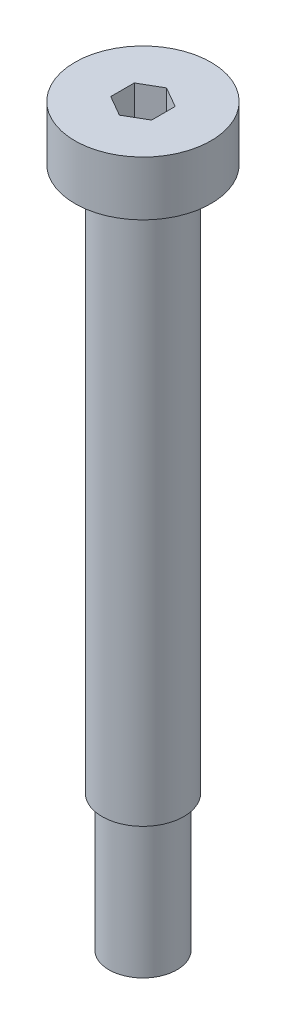
ISO-10303-21;
HEADER;
FILE_DESCRIPTION(('STEP AP214'),'2;1');
FILE_NAME('part.step','',(''),(''),'','','');
FILE_SCHEMA(('AUTOMOTIVE_DESIGN { 1 0 10303 214 1 1 1 1 }'));
ENDSEC;
DATA;
#1=APPLICATION_CONTEXT('core data for automotive mechanical design processes');
#2=APPLICATION_PROTOCOL_DEFINITION('international standard','automotive_design',2000,#1);
#3=PRODUCT_CONTEXT('',#1,'mechanical');
#4=PRODUCT('Part','Part','',(#3));
#5=PRODUCT_RELATED_PRODUCT_CATEGORY('part','',(#4));
#6=PRODUCT_DEFINITION_FORMATION('','',#4);
#7=PRODUCT_DEFINITION_CONTEXT('part definition',#1,'design');
#8=PRODUCT_DEFINITION('design','',#6,#7);
#9=PRODUCT_DEFINITION_SHAPE('','',#8);
#10=(LENGTH_UNIT() NAMED_UNIT(*) SI_UNIT(.MILLI.,.METRE.));
#11=(NAMED_UNIT(*) PLANE_ANGLE_UNIT() SI_UNIT($,.RADIAN.));
#12=(NAMED_UNIT(*) SI_UNIT($,.STERADIAN.) SOLID_ANGLE_UNIT());
#13=UNCERTAINTY_MEASURE_WITH_UNIT(LENGTH_MEASURE(1.E-05),#10,'distance_accuracy_value','');
#14=(GEOMETRIC_REPRESENTATION_CONTEXT(3) GLOBAL_UNCERTAINTY_ASSIGNED_CONTEXT((#13)) GLOBAL_UNIT_ASSIGNED_CONTEXT((#10,
#11,#12)) REPRESENTATION_CONTEXT('',''));
#15=CARTESIAN_POINT('',(0.,0.,0.));
#16=DIRECTION('',(0.,0.,1.));
#17=DIRECTION('',(1.,0.,0.));
#18=AXIS2_PLACEMENT_3D('',#15,#16,#17);
#19=CARTESIAN_POINT('',(0.,0.,0.));
#20=DIRECTION('',(0.,1.,0.));
#21=DIRECTION('',(-1.,0.,0.));
#22=AXIS2_PLACEMENT_3D('',#19,#20,#21);
#23=PLANE('',#22);
#24=DIRECTION('',(0.,0.,-1.));
#25=VECTOR('',#24,1.);
#26=CARTESIAN_POINT('',(1.5,0.,0.866025403784439));
#27=LINE('',#26,#25);
#28=CARTESIAN_POINT('',(1.5,0.,0.866025403784439));
#29=VERTEX_POINT('',#28);
#30=CARTESIAN_POINT('',(1.5,0.,-0.866025403784439));
#31=VERTEX_POINT('',#30);
#32=EDGE_CURVE('E58',#29,#31,#27,.T.);
#33=ORIENTED_EDGE('',*,*,#32,.F.);
#34=DIRECTION('',(0.866025403784439,0.,-0.5));
#35=VECTOR('',#34,1.);
#36=CARTESIAN_POINT('',(0.,0.,1.73205080756888));
#37=LINE('',#36,#35);
#38=CARTESIAN_POINT('',(0.,0.,1.73205080756888));
#39=VERTEX_POINT('',#38);
#40=EDGE_CURVE('E151',#39,#29,#37,.T.);
#41=ORIENTED_EDGE('',*,*,#40,.F.);
#42=DIRECTION('',(0.866025403784439,0.,0.5));
#43=VECTOR('',#42,1.);
#44=CARTESIAN_POINT('',(-1.5,0.,0.866025403784439));
#45=LINE('',#44,#43);
#46=CARTESIAN_POINT('',(-1.5,0.,0.866025403784439));
#47=VERTEX_POINT('',#46);
#48=EDGE_CURVE('E148',#47,#39,#45,.T.);
#49=ORIENTED_EDGE('',*,*,#48,.F.);
#50=DIRECTION('',(0.,0.,1.));
#51=VECTOR('',#50,1.);
#52=CARTESIAN_POINT('',(-1.5,0.,-0.866025403784439));
#53=LINE('',#52,#51);
#54=CARTESIAN_POINT('',(-1.5,0.,-0.866025403784439));
#55=VERTEX_POINT('',#54);
#56=EDGE_CURVE('E106',#55,#47,#53,.T.);
#57=ORIENTED_EDGE('',*,*,#56,.F.);
#58=DIRECTION('',(-0.866025403784439,0.,0.5));
#59=VECTOR('',#58,1.);
#60=CARTESIAN_POINT('',(0.,0.,-1.73205080756888));
#61=LINE('',#60,#59);
#62=CARTESIAN_POINT('',(0.,0.,-1.73205080756888));
#63=VERTEX_POINT('',#62);
#64=EDGE_CURVE('E142',#63,#55,#61,.T.);
#65=ORIENTED_EDGE('',*,*,#64,.F.);
#66=DIRECTION('',(-0.866025403784439,0.,-0.5));
#67=VECTOR('',#66,1.);
#68=CARTESIAN_POINT('',(1.5,0.,-0.866025403784439));
#69=LINE('',#68,#67);
#70=EDGE_CURVE('E138',#31,#63,#69,.T.);
#71=ORIENTED_EDGE('',*,*,#70,.F.);
#72=EDGE_LOOP('',(#33,#41,#49,#57,#65,#71));
#73=FACE_BOUND('',#72,.T.);
#74=CARTESIAN_POINT('',(0.,0.,0.));
#75=DIRECTION('',(0.,1.,0.));
#76=DIRECTION('',(-1.,0.,0.));
#77=AXIS2_PLACEMENT_3D('',#74,#75,#76);
#78=CIRCLE('',#77,5.);
#79=CARTESIAN_POINT('',(-5.,0.,0.));
#80=VERTEX_POINT('',#79);
#81=EDGE_CURVE('E11',#80,#80,#78,.T.);
#82=ORIENTED_EDGE('',*,*,#81,.T.);
#83=EDGE_LOOP('',(#82));
#84=FACE_BOUND('',#83,.T.);
#85=ADVANCED_FACE('F43',(#73,#84),#23,.T.);
#86=CARTESIAN_POINT('',(0.,0.,0.));
#87=DIRECTION('',(0.,1.,0.));
#88=DIRECTION('',(-1.,0.,0.));
#89=AXIS2_PLACEMENT_3D('',#86,#87,#88);
#90=CYLINDRICAL_SURFACE('',#89,5.);
#91=CARTESIAN_POINT('',(0.,-4.,0.));
#92=DIRECTION('',(0.,1.,0.));
#93=DIRECTION('',(-1.,0.,0.));
#94=AXIS2_PLACEMENT_3D('',#91,#92,#93);
#95=CIRCLE('',#94,5.);
#96=CARTESIAN_POINT('',(-5.,-4.,0.));
#97=VERTEX_POINT('',#96);
#98=EDGE_CURVE('E51',#97,#97,#95,.T.);
#99=ORIENTED_EDGE('',*,*,#98,.T.);
#100=EDGE_LOOP('',(#99));
#101=FACE_BOUND('',#100,.T.);
#102=ORIENTED_EDGE('',*,*,#81,.F.);
#103=EDGE_LOOP('',(#102));
#104=FACE_BOUND('',#103,.T.);
#105=ADVANCED_FACE('F185',(#101,#104),#90,.T.);
#106=CARTESIAN_POINT('',(-5.,-4.,0.));
#107=DIRECTION('',(0.,-1.,0.));
#108=DIRECTION('',(1.,0.,0.));
#109=AXIS2_PLACEMENT_3D('',#106,#107,#108);
#110=PLANE('',#109);
#111=CARTESIAN_POINT('',(0.,-4.,0.));
#112=DIRECTION('',(0.,1.,0.));
#113=DIRECTION('',(-1.,0.,0.));
#114=AXIS2_PLACEMENT_3D('',#111,#112,#113);
#115=CIRCLE('',#114,3.);
#116=CARTESIAN_POINT('',(-3.,-4.,0.));
#117=VERTEX_POINT('',#116);
#118=EDGE_CURVE('E178',#117,#117,#115,.T.);
#119=ORIENTED_EDGE('',*,*,#118,.T.);
#120=EDGE_LOOP('',(#119));
#121=FACE_BOUND('',#120,.T.);
#122=ORIENTED_EDGE('',*,*,#98,.F.);
#123=EDGE_LOOP('',(#122));
#124=FACE_BOUND('',#123,.T.);
#125=ADVANCED_FACE('F188',(#121,#124),#110,.T.);
#126=CARTESIAN_POINT('',(0.,0.,0.));
#127=DIRECTION('',(0.,1.,0.));
#128=DIRECTION('',(-1.,0.,0.));
#129=AXIS2_PLACEMENT_3D('',#126,#127,#128);
#130=CYLINDRICAL_SURFACE('',#129,3.);
#131=CARTESIAN_POINT('',(0.,-44.,0.));
#132=DIRECTION('',(0.,1.,0.));
#133=DIRECTION('',(-1.,0.,0.));
#134=AXIS2_PLACEMENT_3D('',#131,#132,#133);
#135=CIRCLE('',#134,3.);
#136=CARTESIAN_POINT('',(-2.99999999999999,-44.,0.));
#137=VERTEX_POINT('',#136);
#138=EDGE_CURVE('E174',#137,#137,#135,.T.);
#139=ORIENTED_EDGE('',*,*,#138,.T.);
#140=EDGE_LOOP('',(#139));
#141=FACE_BOUND('',#140,.T.);
#142=ORIENTED_EDGE('',*,*,#118,.F.);
#143=EDGE_LOOP('',(#142));
#144=FACE_BOUND('',#143,.T.);
#145=ADVANCED_FACE('F190',(#141,#144),#130,.T.);
#146=CARTESIAN_POINT('',(-2.99999999999999,-44.,0.));
#147=DIRECTION('',(0.,-1.,0.));
#148=DIRECTION('',(1.,0.,0.));
#149=AXIS2_PLACEMENT_3D('',#146,#147,#148);
#150=PLANE('',#149);
#151=CARTESIAN_POINT('',(0.,-44.,0.));
#152=DIRECTION('',(0.,1.,0.));
#153=DIRECTION('',(-1.,0.,0.));
#154=AXIS2_PLACEMENT_3D('',#151,#152,#153);
#155=CIRCLE('',#154,2.5);
#156=CARTESIAN_POINT('',(-2.49999999999999,-44.,0.));
#157=VERTEX_POINT('',#156);
#158=EDGE_CURVE('E170',#157,#157,#155,.T.);
#159=ORIENTED_EDGE('',*,*,#158,.T.);
#160=EDGE_LOOP('',(#159));
#161=FACE_BOUND('',#160,.T.);
#162=ORIENTED_EDGE('',*,*,#138,.F.);
#163=EDGE_LOOP('',(#162));
#164=FACE_BOUND('',#163,.T.);
#165=ADVANCED_FACE('F197',(#161,#164),#150,.T.);
#166=CARTESIAN_POINT('',(0.,0.,0.));
#167=DIRECTION('',(0.,1.,0.));
#168=DIRECTION('',(-1.,0.,0.));
#169=AXIS2_PLACEMENT_3D('',#166,#167,#168);
#170=CYLINDRICAL_SURFACE('',#169,2.5);
#171=CARTESIAN_POINT('',(0.,-54.,0.));
#172=DIRECTION('',(0.,1.,0.));
#173=DIRECTION('',(-1.,0.,0.));
#174=AXIS2_PLACEMENT_3D('',#171,#172,#173);
#175=CIRCLE('',#174,2.5);
#176=CARTESIAN_POINT('',(-2.49999999999999,-54.,0.));
#177=VERTEX_POINT('',#176);
#178=EDGE_CURVE('E157',#177,#177,#175,.T.);
#179=ORIENTED_EDGE('',*,*,#178,.T.);
#180=EDGE_LOOP('',(#179));
#181=FACE_BOUND('',#180,.T.);
#182=ORIENTED_EDGE('',*,*,#158,.F.);
#183=EDGE_LOOP('',(#182));
#184=FACE_BOUND('',#183,.T.);
#185=ADVANCED_FACE('F224',(#181,#184),#170,.T.);
#186=CARTESIAN_POINT('',(-2.49999999999999,-54.,0.));
#187=DIRECTION('',(0.,-1.,0.));
#188=DIRECTION('',(1.,0.,0.));
#189=AXIS2_PLACEMENT_3D('',#186,#187,#188);
#190=PLANE('',#189);
#191=ORIENTED_EDGE('',*,*,#178,.F.);
#192=EDGE_LOOP('',(#191));
#193=FACE_BOUND('',#192,.T.);
#194=ADVANCED_FACE('F218',(#193),#190,.T.);
#195=CARTESIAN_POINT('',(1.5,-3.,0.866025403784439));
#196=DIRECTION('',(1.,0.,0.));
#197=DIRECTION('',(0.,0.,-1.));
#198=AXIS2_PLACEMENT_3D('',#195,#196,#197);
#199=PLANE('',#198);
#200=ORIENTED_EDGE('',*,*,#32,.T.);
#201=DIRECTION('',(0.,1.,0.));
#202=VECTOR('',#201,1.);
#203=CARTESIAN_POINT('',(1.5,-3.,-0.866025403784439));
#204=LINE('',#203,#202);
#205=CARTESIAN_POINT('',(1.5,-3.,-0.866025403784439));
#206=VERTEX_POINT('',#205);
#207=EDGE_CURVE('E88',#206,#31,#204,.T.);
#208=ORIENTED_EDGE('',*,*,#207,.F.);
#209=DIRECTION('',(0.,0.,-1.));
#210=VECTOR('',#209,1.);
#211=CARTESIAN_POINT('',(1.5,-3.,0.866025403784439));
#212=LINE('',#211,#210);
#213=CARTESIAN_POINT('',(1.5,-3.,0.866025403784439));
#214=VERTEX_POINT('',#213);
#215=EDGE_CURVE('E154',#214,#206,#212,.T.);
#216=ORIENTED_EDGE('',*,*,#215,.F.);
#217=DIRECTION('',(0.,1.,0.));
#218=VECTOR('',#217,1.);
#219=CARTESIAN_POINT('',(1.5,-3.,0.866025403784439));
#220=LINE('',#219,#218);
#221=EDGE_CURVE('E66',#214,#29,#220,.T.);
#222=ORIENTED_EDGE('',*,*,#221,.T.);
#223=EDGE_LOOP('',(#200,#208,#216,#222));
#224=FACE_BOUND('',#223,.T.);
#225=ADVANCED_FACE('F216',(#224),#199,.F.);
#226=CARTESIAN_POINT('',(0.,-3.,1.73205080756888));
#227=DIRECTION('',(0.5,0.,0.866025403784439));
#228=DIRECTION('',(0.866025403784439,0.,-0.5));
#229=AXIS2_PLACEMENT_3D('',#226,#227,#228);
#230=PLANE('',#229);
#231=ORIENTED_EDGE('',*,*,#40,.T.);
#232=ORIENTED_EDGE('',*,*,#221,.F.);
#233=DIRECTION('',(0.866025403784439,0.,-0.5));
#234=VECTOR('',#233,1.);
#235=CARTESIAN_POINT('',(0.,-3.,1.73205080756888));
#236=LINE('',#235,#234);
#237=CARTESIAN_POINT('',(0.,-3.,1.73205080756888));
#238=VERTEX_POINT('',#237);
#239=EDGE_CURVE('E120',#238,#214,#236,.T.);
#240=ORIENTED_EDGE('',*,*,#239,.F.);
#241=DIRECTION('',(0.,1.,0.));
#242=VECTOR('',#241,1.);
#243=CARTESIAN_POINT('',(0.,-3.,1.73205080756888));
#244=LINE('',#243,#242);
#245=EDGE_CURVE('E111',#238,#39,#244,.T.);
#246=ORIENTED_EDGE('',*,*,#245,.T.);
#247=EDGE_LOOP('',(#231,#232,#240,#246));
#248=FACE_BOUND('',#247,.T.);
#249=ADVANCED_FACE('F217',(#248),#230,.F.);
#250=CARTESIAN_POINT('',(-1.5,-3.,0.866025403784439));
#251=DIRECTION('',(-0.5,0.,0.866025403784439));
#252=DIRECTION('',(0.866025403784439,0.,0.5));
#253=AXIS2_PLACEMENT_3D('',#250,#251,#252);
#254=PLANE('',#253);
#255=ORIENTED_EDGE('',*,*,#48,.T.);
#256=ORIENTED_EDGE('',*,*,#245,.F.);
#257=DIRECTION('',(0.866025403784439,0.,0.5));
#258=VECTOR('',#257,1.);
#259=CARTESIAN_POINT('',(-1.5,-3.,0.866025403784439));
#260=LINE('',#259,#258);
#261=CARTESIAN_POINT('',(-1.5,-3.,0.866025403784439));
#262=VERTEX_POINT('',#261);
#263=EDGE_CURVE('E115',#262,#238,#260,.T.);
#264=ORIENTED_EDGE('',*,*,#263,.F.);
#265=DIRECTION('',(0.,1.,0.));
#266=VECTOR('',#265,1.);
#267=CARTESIAN_POINT('',(-1.5,-3.,0.866025403784439));
#268=LINE('',#267,#266);
#269=EDGE_CURVE('E99',#262,#47,#268,.T.);
#270=ORIENTED_EDGE('',*,*,#269,.T.);
#271=EDGE_LOOP('',(#255,#256,#264,#270));
#272=FACE_BOUND('',#271,.T.);
#273=ADVANCED_FACE('F116',(#272),#254,.F.);
#274=CARTESIAN_POINT('',(-1.5,-3.,-0.866025403784439));
#275=DIRECTION('',(-1.,0.,0.));
#276=DIRECTION('',(0.,-1.,0.));
#277=AXIS2_PLACEMENT_3D('',#274,#275,#276);
#278=PLANE('',#277);
#279=ORIENTED_EDGE('',*,*,#56,.T.);
#280=ORIENTED_EDGE('',*,*,#269,.F.);
#281=DIRECTION('',(0.,0.,1.));
#282=VECTOR('',#281,1.);
#283=CARTESIAN_POINT('',(-1.5,-3.,-0.866025403784439));
#284=LINE('',#283,#282);
#285=CARTESIAN_POINT('',(-1.5,-3.,-0.866025403784439));
#286=VERTEX_POINT('',#285);
#287=EDGE_CURVE('E103',#286,#262,#284,.T.);
#288=ORIENTED_EDGE('',*,*,#287,.F.);
#289=DIRECTION('',(0.,1.,0.));
#290=VECTOR('',#289,1.);
#291=CARTESIAN_POINT('',(-1.5,-3.,-0.866025403784439));
#292=LINE('',#291,#290);
#293=EDGE_CURVE('E112',#286,#55,#292,.T.);
#294=ORIENTED_EDGE('',*,*,#293,.T.);
#295=EDGE_LOOP('',(#279,#280,#288,#294));
#296=FACE_BOUND('',#295,.T.);
#297=ADVANCED_FACE('F101',(#296),#278,.F.);
#298=CARTESIAN_POINT('',(0.,-3.,-1.73205080756888));
#299=DIRECTION('',(-0.5,0.,-0.866025403784439));
#300=DIRECTION('',(-0.866025403784439,0.,0.5));
#301=AXIS2_PLACEMENT_3D('',#298,#299,#300);
#302=PLANE('',#301);
#303=ORIENTED_EDGE('',*,*,#64,.T.);
#304=ORIENTED_EDGE('',*,*,#293,.F.);
#305=DIRECTION('',(-0.866025403784439,0.,0.5));
#306=VECTOR('',#305,1.);
#307=CARTESIAN_POINT('',(0.,-3.,-1.73205080756888));
#308=LINE('',#307,#306);
#309=CARTESIAN_POINT('',(0.,-3.,-1.73205080756888));
#310=VERTEX_POINT('',#309);
#311=EDGE_CURVE('E126',#310,#286,#308,.T.);
#312=ORIENTED_EDGE('',*,*,#311,.F.);
#313=DIRECTION('',(0.,1.,0.));
#314=VECTOR('',#313,1.);
#315=CARTESIAN_POINT('',(0.,-3.,-1.73205080756888));
#316=LINE('',#315,#314);
#317=EDGE_CURVE('E162',#310,#63,#316,.T.);
#318=ORIENTED_EDGE('',*,*,#317,.T.);
#319=EDGE_LOOP('',(#303,#304,#312,#318));
#320=FACE_BOUND('',#319,.T.);
#321=ADVANCED_FACE('F283',(#320),#302,.F.);
#322=CARTESIAN_POINT('',(1.5,-3.,-0.866025403784439));
#323=DIRECTION('',(0.5,0.,-0.866025403784439));
#324=DIRECTION('',(-0.866025403784439,0.,-0.5));
#325=AXIS2_PLACEMENT_3D('',#322,#323,#324);
#326=PLANE('',#325);
#327=ORIENTED_EDGE('',*,*,#70,.T.);
#328=ORIENTED_EDGE('',*,*,#317,.F.);
#329=DIRECTION('',(-0.866025403784439,0.,-0.5));
#330=VECTOR('',#329,1.);
#331=CARTESIAN_POINT('',(1.5,-3.,-0.866025403784439));
#332=LINE('',#331,#330);
#333=EDGE_CURVE('E130',#206,#310,#332,.T.);
#334=ORIENTED_EDGE('',*,*,#333,.F.);
#335=ORIENTED_EDGE('',*,*,#207,.T.);
#336=EDGE_LOOP('',(#327,#328,#334,#335));
#337=FACE_BOUND('',#336,.T.);
#338=ADVANCED_FACE('F212',(#337),#326,.F.);
#339=CARTESIAN_POINT('',(0.,-3.,0.));
#340=DIRECTION('',(0.,1.,0.));
#341=DIRECTION('',(-1.,0.,0.));
#342=AXIS2_PLACEMENT_3D('',#339,#340,#341);
#343=PLANE('',#342);
#344=ORIENTED_EDGE('',*,*,#215,.T.);
#345=ORIENTED_EDGE('',*,*,#333,.T.);
#346=ORIENTED_EDGE('',*,*,#311,.T.);
#347=ORIENTED_EDGE('',*,*,#287,.T.);
#348=ORIENTED_EDGE('',*,*,#263,.T.);
#349=ORIENTED_EDGE('',*,*,#239,.T.);
#350=EDGE_LOOP('',(#344,#345,#346,#347,#348,#349));
#351=FACE_BOUND('',#350,.T.);
#352=ADVANCED_FACE('F123',(#351),#343,.T.);
#353=CLOSED_SHELL('',(#85,#105,#125,#145,#165,#185,#194,#225,#249,#273,#297,#321,#338,#352));
#354=MANIFOLD_SOLID_BREP('B2',#353);
#355=ADVANCED_BREP_SHAPE_REPRESENTATION('',(#18,#354),#14);
#356=SHAPE_DEFINITION_REPRESENTATION(#9,#355);
ENDSEC;
END-ISO-10303-21;
